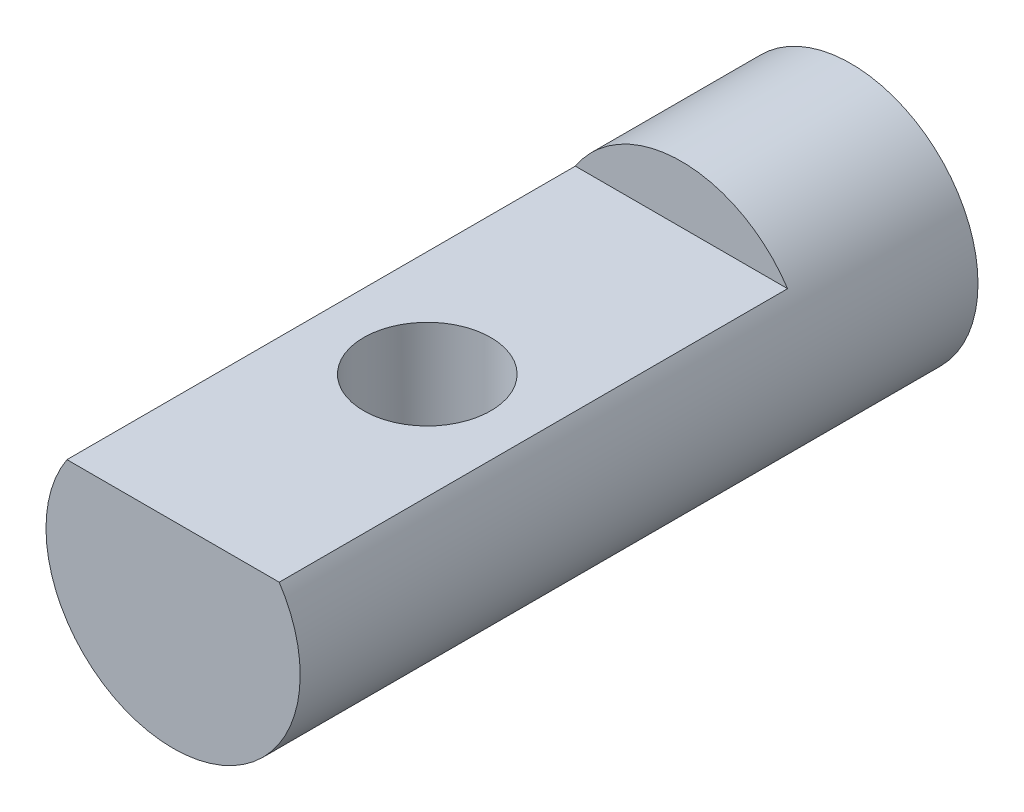
ISO-10303-21;
HEADER;
FILE_DESCRIPTION(('STEP AP214'),'2;1');
FILE_NAME('part.step','',(''),(''),'','','');
FILE_SCHEMA(('AUTOMOTIVE_DESIGN { 1 0 10303 214 1 1 1 1 }'));
ENDSEC;
DATA;
#1=APPLICATION_CONTEXT('core data for automotive mechanical design processes');
#2=APPLICATION_PROTOCOL_DEFINITION('international standard','automotive_design',2000,#1);
#3=PRODUCT_CONTEXT('',#1,'mechanical');
#4=PRODUCT('Part','Part','',(#3));
#5=PRODUCT_RELATED_PRODUCT_CATEGORY('part','',(#4));
#6=PRODUCT_DEFINITION_FORMATION('','',#4);
#7=PRODUCT_DEFINITION_CONTEXT('part definition',#1,'design');
#8=PRODUCT_DEFINITION('design','',#6,#7);
#9=PRODUCT_DEFINITION_SHAPE('','',#8);
#10=(LENGTH_UNIT() NAMED_UNIT(*) SI_UNIT(.MILLI.,.METRE.));
#11=(NAMED_UNIT(*) PLANE_ANGLE_UNIT() SI_UNIT($,.RADIAN.));
#12=(NAMED_UNIT(*) SI_UNIT($,.STERADIAN.) SOLID_ANGLE_UNIT());
#13=UNCERTAINTY_MEASURE_WITH_UNIT(LENGTH_MEASURE(1.E-05),#10,'distance_accuracy_value','');
#14=(GEOMETRIC_REPRESENTATION_CONTEXT(3) GLOBAL_UNCERTAINTY_ASSIGNED_CONTEXT((#13)) GLOBAL_UNIT_ASSIGNED_CONTEXT((#10,
#11,#12)) REPRESENTATION_CONTEXT('',''));
#15=CARTESIAN_POINT('',(0.,0.,0.));
#16=DIRECTION('',(0.,0.,1.));
#17=DIRECTION('',(1.,0.,0.));
#18=AXIS2_PLACEMENT_3D('',#15,#16,#17);
#19=CARTESIAN_POINT('',(0.,0.,16.));
#20=DIRECTION('',(0.,0.,-1.));
#21=DIRECTION('',(-1.,0.,0.));
#22=AXIS2_PLACEMENT_3D('',#19,#20,#21);
#23=CYLINDRICAL_SURFACE('',#22,3.);
#24=CARTESIAN_POINT('',(-1.5,-2.59807621135332,10.));
#25=CARTESIAN_POINT('',(-1.4999945446118,-2.59808302092689,10.0781617122929));
#26=CARTESIAN_POINT('',(-1.49384995609982,-2.60165701781635,10.1564221172876));
#27=CARTESIAN_POINT('',(-1.46958481484708,-2.61543549678079,10.3105408970157));
#28=CARTESIAN_POINT('',(-1.45143909683127,-2.62565391083339,10.3863938725651));
#29=CARTESIAN_POINT('',(-1.40414992304972,-2.65124019908098,10.5331774965159));
#30=CARTESIAN_POINT('',(-1.3750649287406,-2.66658065209878,10.6041319787104));
#31=CARTESIAN_POINT('',(-1.30690128806456,-2.70063997225287,10.7401363029951));
#32=CARTESIAN_POINT('',(-1.26782210105366,-2.71935902214097,10.8051858253937));
#33=CARTESIAN_POINT('',(-1.17699981079632,-2.75995303586162,10.9334585928363));
#34=CARTESIAN_POINT('',(-1.12447805421566,-2.7819609545693,10.9960887035103));
#35=CARTESIAN_POINT('',(-1.0098807114217,-2.82557974178558,11.1121125826101));
#36=CARTESIAN_POINT('',(-0.94780038867344,-2.84719040746875,11.1655017438753));
#37=CARTESIAN_POINT('',(-0.810734345121819,-2.88932215429423,11.2650507267215));
#38=CARTESIAN_POINT('',(-0.735160783518863,-2.90967159627259,11.3104806517893));
#39=CARTESIAN_POINT('',(-0.576235539899257,-2.94526134149293,11.3877112798686));
#40=CARTESIAN_POINT('',(-0.492888807207233,-2.96050486775612,11.4195205842058));
#41=CARTESIAN_POINT('',(-0.327067415888966,-2.98320691866356,11.4662569919516));
#42=CARTESIAN_POINT('',(-0.244952685733227,-2.99114220331338,11.4822242895333));
#43=CARTESIAN_POINT('',(-0.0788559430467728,-3.000113757691,11.5002491780126));
#44=CARTESIAN_POINT('',(0.00512490876560717,-3.00115420176885,11.5023151851936));
#45=CARTESIAN_POINT('',(0.164748786635625,-2.99644472874675,11.4928799890445));
#46=CARTESIAN_POINT('',(0.240481798765187,-2.99127743838241,11.4825429767182));
#47=CARTESIAN_POINT('',(0.388970657877483,-2.97561367889621,11.450678734143));
#48=CARTESIAN_POINT('',(0.461726281640888,-2.96511681099591,11.4291506665357));
#49=CARTESIAN_POINT('',(0.60346408735433,-2.93957374931481,11.3753761508653));
#50=CARTESIAN_POINT('',(0.672380135272767,-2.92446662293799,11.3429855302419));
#51=CARTESIAN_POINT('',(0.803965202269992,-2.89106468980031,11.2686048756978));
#52=CARTESIAN_POINT('',(0.866631973257968,-2.87276874236226,11.2266114050465));
#53=CARTESIAN_POINT('',(0.990260491347292,-2.83266591598844,11.1296569727005));
#54=CARTESIAN_POINT('',(1.05050111254404,-2.81069063997263,11.073845457511));
#55=CARTESIAN_POINT('',(1.16115655544667,-2.76681510880217,10.9531154126047));
#56=CARTESIAN_POINT('',(1.21156381736135,-2.74491492398443,10.8881899415889));
#57=CARTESIAN_POINT('',(1.30425800196332,-2.70216234138727,10.7460277113639));
#58=CARTESIAN_POINT('',(1.34582597246708,-2.68146479986061,10.6682709654187));
#59=CARTESIAN_POINT('',(1.41497866950185,-2.64563175417864,10.5055934929615));
#60=CARTESIAN_POINT('',(1.44257798731634,-2.63049045069101,10.4206803504737));
#61=CARTESIAN_POINT('',(1.48077031653756,-2.60916953725551,10.2531782330758));
#62=CARTESIAN_POINT('',(1.49253768317996,-2.60237483772744,10.1709383214347));
#63=CARTESIAN_POINT('',(1.50227541991714,-2.59676879042414,10.0053979877252));
#64=CARTESIAN_POINT('',(1.50025553597254,-2.59795180333967,9.92209835632032));
#65=CARTESIAN_POINT('',(1.48355406501595,-2.60751504810877,9.76651912213191));
#66=CARTESIAN_POINT('',(1.4702817250687,-2.61509381259981,9.69403082333811));
#67=CARTESIAN_POINT('',(1.43354442694866,-2.63541032327011,9.55244832059357));
#68=CARTESIAN_POINT('',(1.41007616793542,-2.64814974007551,9.48335522388009));
#69=CARTESIAN_POINT('',(1.35247138290733,-2.67804333119485,9.34688300364596));
#70=CARTESIAN_POINT('',(1.31789109553909,-2.69537464864595,9.27973147471967));
#71=CARTESIAN_POINT('',(1.23943059602371,-2.73234179245874,9.15179609269151));
#72=CARTESIAN_POINT('',(1.19554560649832,-2.75197880032721,9.09101553473007));
#73=CARTESIAN_POINT('',(1.09325575079828,-2.79431997684504,8.96953184871468));
#74=CARTESIAN_POINT('',(1.03371790847245,-2.81709874731433,8.90980427392351));
#75=CARTESIAN_POINT('',(0.905106743097433,-2.86101352466839,8.80088164300961));
#76=CARTESIAN_POINT('',(0.836030211983022,-2.88214897511564,8.75169014465419));
#77=CARTESIAN_POINT('',(0.687803043838138,-2.92112042536435,8.66413941107485));
#78=CARTESIAN_POINT('',(0.608434646361172,-2.93885462508044,8.62610032268364));
#79=CARTESIAN_POINT('',(0.443283546961625,-2.96825032438951,8.56429314421391));
#80=CARTESIAN_POINT('',(0.357506552088266,-2.97991715514559,8.54051252295054));
#81=CARTESIAN_POINT('',(0.190469523495628,-2.99501262272824,8.50994715373801));
#82=CARTESIAN_POINT('',(0.109517165775688,-2.99909891862287,8.50180318618583));
#83=CARTESIAN_POINT('',(-0.0526889789268034,-3.00063195562697,8.4987351018184));
#84=CARTESIAN_POINT('',(-0.133942650442629,-2.99808102100335,8.50380635721466));
#85=CARTESIAN_POINT('',(-0.288806988475719,-2.98700953256884,8.52612461019343));
#86=CARTESIAN_POINT('',(-0.362568476716894,-2.97889342001985,8.54254727388651));
#87=CARTESIAN_POINT('',(-0.506168928275425,-2.95788140495135,8.58599049895446));
#88=CARTESIAN_POINT('',(-0.576007327433262,-2.94498481699193,8.61301258014018));
#89=CARTESIAN_POINT('',(-0.713135109367326,-2.9148889612218,8.67809057824896));
#90=CARTESIAN_POINT('',(-0.780187714050068,-2.89752925798199,8.71656898481176));
#91=CARTESIAN_POINT('',(-0.907161962721036,-2.86032199712739,8.80293689628857));
#92=CARTESIAN_POINT('',(-0.96708031112236,-2.84047329837541,8.85083072367351));
#93=CARTESIAN_POINT('',(-1.08437100623534,-2.79792915339941,8.96019570853406));
#94=CARTESIAN_POINT('',(-1.14089652680891,-2.77514698517547,9.02254373121579));
#95=CARTESIAN_POINT('',(-1.24299493109201,-2.73094614244278,9.15617608169465));
#96=CARTESIAN_POINT('',(-1.28855812501509,-2.70952868642798,9.22746823130153));
#97=CARTESIAN_POINT('',(-1.36864661967848,-2.66999407957374,9.37995496987143));
#98=CARTESIAN_POINT('',(-1.40277759894141,-2.65200261384405,9.4613912966931));
#99=CARTESIAN_POINT('',(-1.45631806425962,-2.62299234492527,9.62999860650967));
#100=CARTESIAN_POINT('',(-1.47577678676302,-2.61195024221553,9.71714933336903));
#101=CARTESIAN_POINT('',(-1.49155051179662,-2.60293908902686,9.83770803347799));
#102=CARTESIAN_POINT('',(-1.49471415744578,-2.60112193507727,9.87005184159682));
#103=CARTESIAN_POINT('',(-1.49894010763494,-2.59868903831625,9.93492472102337));
#104=CARTESIAN_POINT('',(-1.50000227159981,-2.59807337587664,9.96745380457881));
#105=CARTESIAN_POINT('',(-1.5,-2.59807621135332,10.));
#106=B_SPLINE_CURVE_WITH_KNOTS('',3,(#24,#25,#26,#27,#28,#29,#30,#31,#32,#33,#34,#35,#36,#37,
#38,#39,#40,#41,#42,#43,#44,#45,#46,#47,#48,#49,#50,#51,#52,#53,#54,#55,#56,#57,#58,#59,#60,#61,
#62,#63,#64,#65,#66,#67,#68,#69,#70,#71,#72,#73,#74,#75,#76,#77,#78,#79,#80,#81,#82,#83,#84,#85,
#86,#87,#88,#89,#90,#91,#92,#93,#94,#95,#96,#97,#98,#99,#100,#101,#102,#103,#104,#105),
.UNSPECIFIED.,.T.,.F.,(4,2,2,2,2,2,2,2,2,2,2,2,2,2,2,2,2,2,2,2,2,2,2,2,2,2,2,2,2,2,2,2,2,2,2,2,
2,2,2,2,4),(0.,0.234348183892073,0.469189339237207,0.702792893878329,0.936409088167725,
1.18929346874735,1.44230356626556,1.71236838358145,1.98226240445836,2.23295227451903,
2.4834903552906,2.71224146226807,2.94100968776183,3.1729430209672,3.40495949025408,
3.65890787185336,3.91305072368878,4.18333262594172,4.45333161317557,4.70193436281317,
4.95036139782559,5.17161275136038,5.39293578654094,5.62450944609131,5.85620229330071,
6.1171011537092,6.37808797467303,6.64596272119448,6.91360169713157,7.1566840558423,
7.39968130190957,7.62666637307239,7.85368400268019,8.09041126079208,8.32724745151078,
8.58765362775101,8.84828914267731,9.11716123557907,9.3851269950414,9.48270202777964,
9.58028358741811),.UNSPECIFIED.);
#107=CARTESIAN_POINT('',(-1.5,-2.59807621135332,10.));
#108=VERTEX_POINT('',#107);
#109=EDGE_CURVE('E63',#108,#108,#106,.T.);
#110=ORIENTED_EDGE('',*,*,#109,.T.);
#111=EDGE_LOOP('',(#110));
#112=FACE_BOUND('',#111,.T.);
#113=CARTESIAN_POINT('',(0.,0.,16.));
#114=DIRECTION('',(0.,0.,1.));
#115=DIRECTION('',(1.,0.,0.));
#116=AXIS2_PLACEMENT_3D('',#113,#114,#115);
#117=CIRCLE('',#116,3.);
#118=CARTESIAN_POINT('',(-2.50549396327351,1.65,16.));
#119=VERTEX_POINT('',#118);
#120=CARTESIAN_POINT('',(2.50549396327351,1.65,16.));
#121=VERTEX_POINT('',#120);
#122=EDGE_CURVE('E11',#119,#121,#117,.T.);
#123=ORIENTED_EDGE('',*,*,#122,.F.);
#124=DIRECTION('',(0.,0.,1.));
#125=VECTOR('',#124,1.);
#126=CARTESIAN_POINT('',(-2.50549396327351,1.65,4.));
#127=LINE('',#126,#125);
#128=CARTESIAN_POINT('',(-2.50549396327351,1.65,4.));
#129=VERTEX_POINT('',#128);
#130=EDGE_CURVE('E47',#129,#119,#127,.T.);
#131=ORIENTED_EDGE('',*,*,#130,.F.);
#132=CARTESIAN_POINT('',(0.,0.,4.));
#133=DIRECTION('',(0.,0.,1.));
#134=DIRECTION('',(1.,0.,0.));
#135=AXIS2_PLACEMENT_3D('',#132,#133,#134);
#136=CIRCLE('',#135,3.);
#137=CARTESIAN_POINT('',(2.50549396327351,1.65,4.));
#138=VERTEX_POINT('',#137);
#139=EDGE_CURVE('E62',#138,#129,#136,.T.);
#140=ORIENTED_EDGE('',*,*,#139,.F.);
#141=DIRECTION('',(0.,0.,1.));
#142=VECTOR('',#141,1.);
#143=CARTESIAN_POINT('',(2.50549396327351,1.65,4.));
#144=LINE('',#143,#142);
#145=EDGE_CURVE('E53',#138,#121,#144,.T.);
#146=ORIENTED_EDGE('',*,*,#145,.T.);
#147=EDGE_LOOP('',(#123,#131,#140,#146));
#148=FACE_BOUND('',#147,.T.);
#149=CARTESIAN_POINT('',(0.,0.,0.));
#150=DIRECTION('',(0.,0.,1.));
#151=DIRECTION('',(1.,0.,0.));
#152=AXIS2_PLACEMENT_3D('',#149,#150,#151);
#153=CIRCLE('',#152,3.);
#154=CARTESIAN_POINT('',(3.,0.,0.));
#155=VERTEX_POINT('',#154);
#156=EDGE_CURVE('E36',#155,#155,#153,.T.);
#157=ORIENTED_EDGE('',*,*,#156,.T.);
#158=EDGE_LOOP('',(#157));
#159=FACE_BOUND('',#158,.T.);
#160=ADVANCED_FACE('F32',(#112,#148,#159),#23,.T.);
#161=CARTESIAN_POINT('',(0.,0.,16.));
#162=DIRECTION('',(0.,0.,1.));
#163=DIRECTION('',(1.,0.,0.));
#164=AXIS2_PLACEMENT_3D('',#161,#162,#163);
#165=PLANE('',#164);
#166=DIRECTION('',(1.,0.,0.));
#167=VECTOR('',#166,1.);
#168=CARTESIAN_POINT('',(-2.50549396327351,1.65,16.));
#169=LINE('',#168,#167);
#170=EDGE_CURVE('E58',#119,#121,#169,.T.);
#171=ORIENTED_EDGE('',*,*,#170,.F.);
#172=ORIENTED_EDGE('',*,*,#122,.T.);
#173=EDGE_LOOP('',(#171,#172));
#174=FACE_BOUND('',#173,.T.);
#175=ADVANCED_FACE('F69',(#174),#165,.T.);
#176=CARTESIAN_POINT('',(0.,0.,0.));
#177=DIRECTION('',(0.,0.,1.));
#178=DIRECTION('',(1.,0.,0.));
#179=AXIS2_PLACEMENT_3D('',#176,#177,#178);
#180=PLANE('',#179);
#181=ORIENTED_EDGE('',*,*,#156,.F.);
#182=EDGE_LOOP('',(#181));
#183=FACE_BOUND('',#182,.T.);
#184=ADVANCED_FACE('F71',(#183),#180,.F.);
#185=CARTESIAN_POINT('',(-2.50549396327351,1.65,4.));
#186=DIRECTION('',(0.,-1.,0.));
#187=DIRECTION('',(1.,0.,0.));
#188=AXIS2_PLACEMENT_3D('',#185,#186,#187);
#189=PLANE('',#188);
#190=CARTESIAN_POINT('',(0.,1.65,10.));
#191=DIRECTION('',(0.,1.,0.));
#192=DIRECTION('',(-1.,0.,0.));
#193=AXIS2_PLACEMENT_3D('',#190,#191,#192);
#194=CIRCLE('',#193,1.5);
#195=CARTESIAN_POINT('',(-1.5,1.65,10.));
#196=VERTEX_POINT('',#195);
#197=EDGE_CURVE('E98',#196,#196,#194,.T.);
#198=ORIENTED_EDGE('',*,*,#197,.F.);
#199=EDGE_LOOP('',(#198));
#200=FACE_BOUND('',#199,.T.);
#201=ORIENTED_EDGE('',*,*,#170,.T.);
#202=ORIENTED_EDGE('',*,*,#145,.F.);
#203=DIRECTION('',(1.,0.,0.));
#204=VECTOR('',#203,1.);
#205=CARTESIAN_POINT('',(-2.50549396327351,1.65,4.));
#206=LINE('',#205,#204);
#207=EDGE_CURVE('E100',#129,#138,#206,.T.);
#208=ORIENTED_EDGE('',*,*,#207,.F.);
#209=ORIENTED_EDGE('',*,*,#130,.T.);
#210=EDGE_LOOP('',(#201,#202,#208,#209));
#211=FACE_BOUND('',#210,.T.);
#212=ADVANCED_FACE('F59',(#200,#211),#189,.F.);
#213=CARTESIAN_POINT('',(0.,0.,4.));
#214=DIRECTION('',(0.,0.,1.));
#215=DIRECTION('',(1.,0.,0.));
#216=AXIS2_PLACEMENT_3D('',#213,#214,#215);
#217=PLANE('',#216);
#218=ORIENTED_EDGE('',*,*,#139,.T.);
#219=ORIENTED_EDGE('',*,*,#207,.T.);
#220=EDGE_LOOP('',(#218,#219));
#221=FACE_BOUND('',#220,.T.);
#222=ADVANCED_FACE('F82',(#221),#217,.T.);
#223=CARTESIAN_POINT('',(0.,-10.35,10.));
#224=DIRECTION('',(0.,1.,0.));
#225=DIRECTION('',(-1.,0.,0.));
#226=AXIS2_PLACEMENT_3D('',#223,#224,#225);
#227=CYLINDRICAL_SURFACE('',#226,1.5);
#228=ORIENTED_EDGE('',*,*,#197,.T.);
#229=EDGE_LOOP('',(#228));
#230=FACE_BOUND('',#229,.T.);
#231=ORIENTED_EDGE('',*,*,#109,.F.);
#232=EDGE_LOOP('',(#231));
#233=FACE_BOUND('',#232,.T.);
#234=ADVANCED_FACE('F86',(#230,#233),#227,.F.);
#235=CLOSED_SHELL('',(#160,#175,#184,#212,#222,#234));
#236=MANIFOLD_SOLID_BREP('B2',#235);
#237=ADVANCED_BREP_SHAPE_REPRESENTATION('',(#18,#236),#14);
#238=SHAPE_DEFINITION_REPRESENTATION(#9,#237);
ENDSEC;
END-ISO-10303-21;
